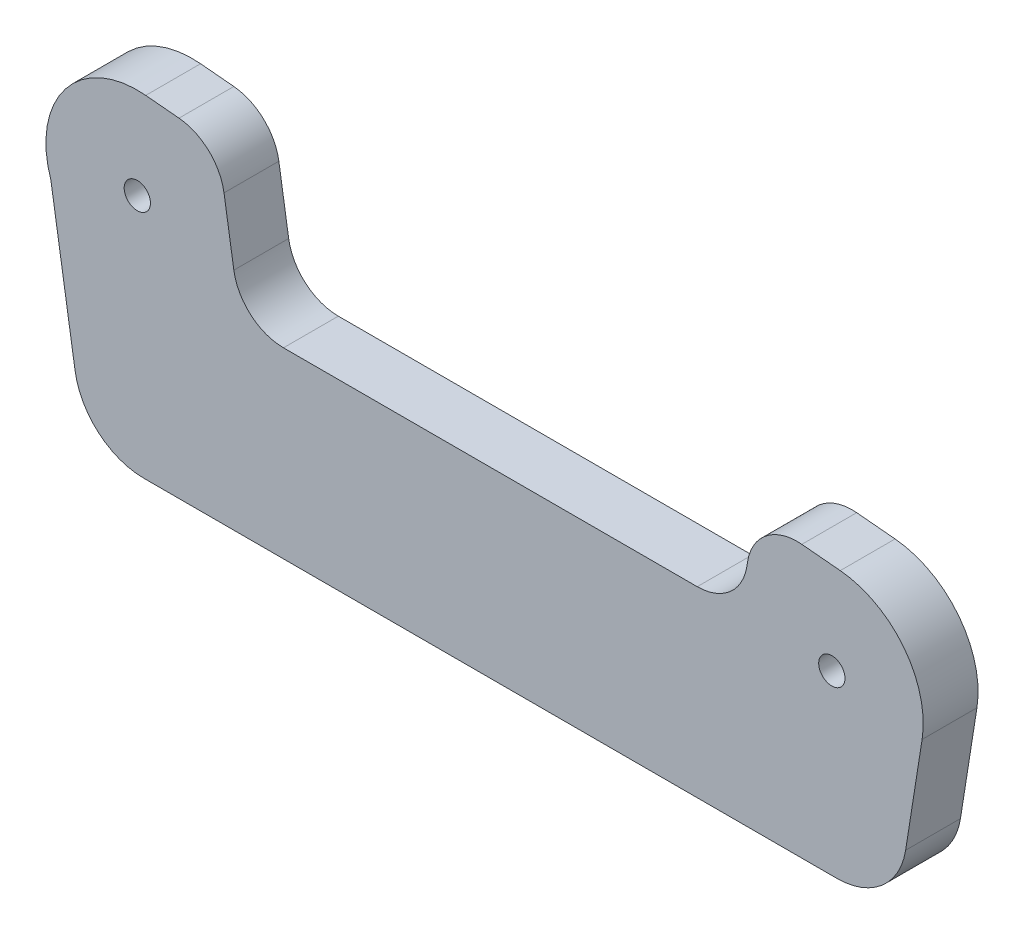
ISO-10303-21;
HEADER;
FILE_DESCRIPTION(('STEP AP214'),'2;1');
FILE_NAME('part.step','',(''),(''),'','','');
FILE_SCHEMA(('AUTOMOTIVE_DESIGN { 1 0 10303 214 1 1 1 1 }'));
ENDSEC;
DATA;
#1=APPLICATION_CONTEXT('core data for automotive mechanical design processes');
#2=APPLICATION_PROTOCOL_DEFINITION('international standard','automotive_design',2000,#1);
#3=PRODUCT_CONTEXT('',#1,'mechanical');
#4=PRODUCT('Part','Part','',(#3));
#5=PRODUCT_RELATED_PRODUCT_CATEGORY('part','',(#4));
#6=PRODUCT_DEFINITION_FORMATION('','',#4);
#7=PRODUCT_DEFINITION_CONTEXT('part definition',#1,'design');
#8=PRODUCT_DEFINITION('design','',#6,#7);
#9=PRODUCT_DEFINITION_SHAPE('','',#8);
#10=(LENGTH_UNIT() NAMED_UNIT(*) SI_UNIT(.MILLI.,.METRE.));
#11=(NAMED_UNIT(*) PLANE_ANGLE_UNIT() SI_UNIT($,.RADIAN.));
#12=(NAMED_UNIT(*) SI_UNIT($,.STERADIAN.) SOLID_ANGLE_UNIT());
#13=UNCERTAINTY_MEASURE_WITH_UNIT(LENGTH_MEASURE(1.E-05),#10,'distance_accuracy_value','');
#14=(GEOMETRIC_REPRESENTATION_CONTEXT(3) GLOBAL_UNCERTAINTY_ASSIGNED_CONTEXT((#13)) GLOBAL_UNIT_ASSIGNED_CONTEXT((#10,
#11,#12)) REPRESENTATION_CONTEXT('',''));
#15=CARTESIAN_POINT('',(0.,0.,0.));
#16=DIRECTION('',(0.,0.,1.));
#17=DIRECTION('',(1.,0.,0.));
#18=AXIS2_PLACEMENT_3D('',#15,#16,#17);
#19=CARTESIAN_POINT('',(3.32127577793633,35.8760563279361,5.999988));
#20=DIRECTION('',(0.092182213968788,0.995742155092277,0.));
#21=DIRECTION('',(-0.995742155092277,0.092182213968788,0.));
#22=AXIS2_PLACEMENT_3D('',#19,#20,#21);
#23=PLANE('',#22);
#24=DIRECTION('',(0.995742155092277,-0.092182213968788,0.));
#25=VECTOR('',#24,1.);
#26=CARTESIAN_POINT('',(3.32127577793633,35.8760563279361,0.));
#27=LINE('',#26,#25);
#28=CARTESIAN_POINT('',(69.6383226526439,29.7366635408386,0.));
#29=VERTEX_POINT('',#28);
#30=CARTESIAN_POINT('',(73.8388350556879,29.3477952669228,0.));
#31=VERTEX_POINT('',#30);
#32=EDGE_CURVE('E203',#29,#31,#27,.T.);
#33=ORIENTED_EDGE('',*,*,#32,.F.);
#34=DIRECTION('',(0.,0.,1.));
#35=VECTOR('',#34,1.);
#36=CARTESIAN_POINT('',(69.6383226526438,29.7366635408386,5.999988));
#37=LINE('',#36,#35);
#38=CARTESIAN_POINT('',(69.6383226526439,29.7366635408386,5.999988));
#39=VERTEX_POINT('',#38);
#40=EDGE_CURVE('E254',#29,#39,#37,.T.);
#41=ORIENTED_EDGE('',*,*,#40,.T.);
#42=DIRECTION('',(0.995742155092277,-0.092182213968788,0.));
#43=VECTOR('',#42,1.);
#44=CARTESIAN_POINT('',(3.32127577793633,35.8760563279361,5.999988));
#45=LINE('',#44,#43);
#46=CARTESIAN_POINT('',(73.8388350556879,29.3477952669228,5.999988));
#47=VERTEX_POINT('',#46);
#48=EDGE_CURVE('E177',#39,#47,#45,.T.);
#49=ORIENTED_EDGE('',*,*,#48,.T.);
#50=DIRECTION('',(0.,0.,-1.));
#51=VECTOR('',#50,1.);
#52=CARTESIAN_POINT('',(73.8388350556879,29.3477952669228,5.999988));
#53=LINE('',#52,#51);
#54=EDGE_CURVE('E200',#47,#31,#53,.T.);
#55=ORIENTED_EDGE('',*,*,#54,.T.);
#56=EDGE_LOOP('',(#33,#41,#49,#55));
#57=FACE_BOUND('',#56,.T.);
#58=ADVANCED_FACE('F37',(#57),#23,.T.);
#59=CARTESIAN_POINT('',(-2.14519077631211,36.3821220669228,5.999988));
#60=VERTEX_POINT('',#59);
#61=CARTESIAN_POINT('',(1.49337603775086,36.0452766869433,5.999988));
#62=VERTEX_POINT('',#61);
#63=EDGE_CURVE('E155',#60,#62,#45,.T.);
#64=ORIENTED_EDGE('',*,*,#63,.T.);
#65=DIRECTION('',(0.,0.,1.));
#66=VECTOR('',#65,1.);
#67=CARTESIAN_POINT('',(1.49337603775086,36.0452766869433,0.));
#68=LINE('',#67,#66);
#69=CARTESIAN_POINT('',(1.49337603775086,36.0452766869433,0.));
#70=VERTEX_POINT('',#69);
#71=EDGE_CURVE('E267',#62,#70,#68,.F.);
#72=ORIENTED_EDGE('',*,*,#71,.T.);
#73=CARTESIAN_POINT('',(-2.14519077631211,36.3821220669228,0.));
#74=VERTEX_POINT('',#73);
#75=EDGE_CURVE('E157',#74,#70,#27,.T.);
#76=ORIENTED_EDGE('',*,*,#75,.F.);
#77=DIRECTION('',(0.,0.,-1.));
#78=VECTOR('',#77,1.);
#79=CARTESIAN_POINT('',(-2.14519077631211,36.3821220669228,5.999988));
#80=LINE('',#79,#78);
#81=EDGE_CURVE('E151',#60,#74,#80,.T.);
#82=ORIENTED_EDGE('',*,*,#81,.F.);
#83=EDGE_LOOP('',(#64,#72,#76,#82));
#84=FACE_BOUND('',#83,.T.);
#85=ADVANCED_FACE('F153',(#84),#23,.T.);
#86=CARTESIAN_POINT('',(-3.067012916,26.424700516,5.999988));
#87=DIRECTION('',(0.,0.,-1.));
#88=DIRECTION('',(-1.,0.,0.));
#89=AXIS2_PLACEMENT_3D('',#86,#87,#88);
#90=CYLINDRICAL_SURFACE('',#89,10.);
#91=CARTESIAN_POINT('',(-3.067012916,26.424700516,0.));
#92=DIRECTION('',(0.,0.,1.));
#93=DIRECTION('',(1.,0.,0.));
#94=AXIS2_PLACEMENT_3D('',#91,#92,#93);
#95=CIRCLE('',#94,10.);
#96=CARTESIAN_POINT('',(-12.5245483205324,23.1758508623508,0.));
#97=VERTEX_POINT('',#96);
#98=EDGE_CURVE('E202',#74,#97,#95,.T.);
#99=ORIENTED_EDGE('',*,*,#98,.T.);
#100=DIRECTION('',(0.,0.,-1.));
#101=VECTOR('',#100,1.);
#102=CARTESIAN_POINT('',(-12.5245483205324,23.1758508623508,5.999988));
#103=LINE('',#102,#101);
#104=CARTESIAN_POINT('',(-12.5245483205324,23.1758508623508,5.999988));
#105=VERTEX_POINT('',#104);
#106=EDGE_CURVE('E161',#105,#97,#103,.T.);
#107=ORIENTED_EDGE('',*,*,#106,.F.);
#108=CARTESIAN_POINT('',(-3.067012916,26.424700516,5.999988));
#109=DIRECTION('',(0.,0.,1.));
#110=DIRECTION('',(1.,0.,0.));
#111=AXIS2_PLACEMENT_3D('',#108,#109,#110);
#112=CIRCLE('',#111,10.);
#113=EDGE_CURVE('E164',#60,#105,#112,.T.);
#114=ORIENTED_EDGE('',*,*,#113,.F.);
#115=ORIENTED_EDGE('',*,*,#81,.T.);
#116=EDGE_LOOP('',(#99,#107,#114,#115));
#117=FACE_BOUND('',#116,.T.);
#118=ADVANCED_FACE('F165',(#117),#90,.T.);
#119=CARTESIAN_POINT('',(-8.64255656417761,-1.36700988840257,5.999988));
#120=DIRECTION('',(0.987720750191728,0.156229701531723,0.));
#121=DIRECTION('',(-0.156229701531723,0.987720750191728,0.));
#122=AXIS2_PLACEMENT_3D('',#119,#120,#121);
#123=PLANE('',#122);
#124=DIRECTION('',(0.156229701531723,-0.987720750191728,0.));
#125=VECTOR('',#124,1.);
#126=CARTESIAN_POINT('',(-8.64255656417761,-1.36700988840257,0.));
#127=LINE('',#126,#125);
#128=CARTESIAN_POINT('',(-9.87575030707435,6.42952967432827,0.));
#129=VERTEX_POINT('',#128);
#130=EDGE_CURVE('E205',#97,#129,#127,.T.);
#131=ORIENTED_EDGE('',*,*,#130,.T.);
#132=DIRECTION('',(0.,0.,-1.));
#133=VECTOR('',#132,1.);
#134=CARTESIAN_POINT('',(-9.87575030707435,6.42952967432827,5.999988));
#135=LINE('',#134,#133);
#136=CARTESIAN_POINT('',(-9.87575030707435,6.42952967432827,5.999988));
#137=VERTEX_POINT('',#136);
#138=EDGE_CURVE('E242',#129,#137,#135,.F.);
#139=ORIENTED_EDGE('',*,*,#138,.T.);
#140=DIRECTION('',(0.156229701531723,-0.987720750191728,0.));
#141=VECTOR('',#140,1.);
#142=CARTESIAN_POINT('',(-8.64255656417761,-1.36700988840257,5.999988));
#143=LINE('',#142,#141);
#144=EDGE_CURVE('E170',#105,#137,#143,.T.);
#145=ORIENTED_EDGE('',*,*,#144,.F.);
#146=ORIENTED_EDGE('',*,*,#106,.T.);
#147=EDGE_LOOP('',(#131,#139,#145,#146));
#148=FACE_BOUND('',#147,.T.);
#149=ADVANCED_FACE('F336',(#148),#123,.F.);
#150=CARTESIAN_POINT('',(0.,0.,5.999988));
#151=DIRECTION('',(0.,1.,0.));
#152=DIRECTION('',(-1.,0.,0.));
#153=AXIS2_PLACEMENT_3D('',#150,#151,#152);
#154=PLANE('',#153);
#155=DIRECTION('',(1.,0.,0.));
#156=VECTOR('',#155,1.);
#157=CARTESIAN_POINT('',(0.,0.,0.));
#158=LINE('',#157,#156);
#159=CARTESIAN_POINT('',(-2.34931819061338,0.,0.));
#160=VERTEX_POINT('',#159);
#161=CARTESIAN_POINT('',(73.4648580709463,0.,0.));
#162=VERTEX_POINT('',#161);
#163=EDGE_CURVE('E208',#160,#162,#158,.T.);
#164=ORIENTED_EDGE('',*,*,#163,.T.);
#165=DIRECTION('',(0.,0.,-1.));
#166=VECTOR('',#165,1.);
#167=CARTESIAN_POINT('',(73.4648580709463,0.,5.999988));
#168=LINE('',#167,#166);
#169=CARTESIAN_POINT('',(73.4648580709463,0.,5.999988));
#170=VERTEX_POINT('',#169);
#171=EDGE_CURVE('E236',#162,#170,#168,.F.);
#172=ORIENTED_EDGE('',*,*,#171,.T.);
#173=DIRECTION('',(1.,0.,0.));
#174=VECTOR('',#173,1.);
#175=CARTESIAN_POINT('',(0.,0.,5.999988));
#176=LINE('',#175,#174);
#177=CARTESIAN_POINT('',(-2.34931819061338,0.,5.999988));
#178=VERTEX_POINT('',#177);
#179=EDGE_CURVE('E185',#178,#170,#176,.T.);
#180=ORIENTED_EDGE('',*,*,#179,.F.);
#181=DIRECTION('',(0.,0.,-1.));
#182=VECTOR('',#181,1.);
#183=CARTESIAN_POINT('',(-2.34931819061338,0.,5.999988));
#184=LINE('',#183,#182);
#185=EDGE_CURVE('E233',#178,#160,#184,.T.);
#186=ORIENTED_EDGE('',*,*,#185,.T.);
#187=EDGE_LOOP('',(#164,#172,#180,#186));
#188=FACE_BOUND('',#187,.T.);
#189=ADVANCED_FACE('F327',(#188),#154,.F.);
#190=CARTESIAN_POINT('',(78.022328285015,-12.3409425775573,5.999988));
#191=DIRECTION('',(0.987720750191728,-0.156229701531722,0.));
#192=DIRECTION('',(0.156229701531722,0.987720750191728,0.));
#193=AXIS2_PLACEMENT_3D('',#190,#191,#192);
#194=PLANE('',#193);
#195=DIRECTION('',(-0.156229701531722,-0.987720750191728,0.));
#196=VECTOR('',#195,1.);
#197=CARTESIAN_POINT('',(78.022328285015,-12.3409425775573,5.999988));
#198=LINE('',#197,#196);
#199=CARTESIAN_POINT('',(82.7942204179173,17.8280767006828,5.999988));
#200=VERTEX_POINT('',#199);
#201=CARTESIAN_POINT('',(80.9912901874073,6.42952967432827,5.999988));
#202=VERTEX_POINT('',#201);
#203=EDGE_CURVE('E188',#200,#202,#198,.T.);
#204=ORIENTED_EDGE('',*,*,#203,.T.);
#205=DIRECTION('',(0.,0.,-1.));
#206=VECTOR('',#205,1.);
#207=CARTESIAN_POINT('',(80.9912901874073,6.42952967432827,0.));
#208=LINE('',#207,#206);
#209=CARTESIAN_POINT('',(80.9912901874073,6.42952967432827,0.));
#210=VERTEX_POINT('',#209);
#211=EDGE_CURVE('E160',#202,#210,#208,.T.);
#212=ORIENTED_EDGE('',*,*,#211,.T.);
#213=DIRECTION('',(-0.156229701531722,-0.987720750191728,0.));
#214=VECTOR('',#213,1.);
#215=CARTESIAN_POINT('',(78.022328285015,-12.3409425775573,0.));
#216=LINE('',#215,#214);
#217=CARTESIAN_POINT('',(82.7942204179173,17.8280767006828,0.));
#218=VERTEX_POINT('',#217);
#219=EDGE_CURVE('E211',#218,#210,#216,.T.);
#220=ORIENTED_EDGE('',*,*,#219,.F.);
#221=DIRECTION('',(0.,0.,-1.));
#222=VECTOR('',#221,1.);
#223=CARTESIAN_POINT('',(82.7942204179173,17.8280767006828,5.999988));
#224=LINE('',#223,#222);
#225=EDGE_CURVE('E224',#200,#218,#224,.T.);
#226=ORIENTED_EDGE('',*,*,#225,.F.);
#227=EDGE_LOOP('',(#204,#212,#220,#226));
#228=FACE_BOUND('',#227,.T.);
#229=ADVANCED_FACE('F318',(#228),#194,.T.);
#230=CARTESIAN_POINT('',(72.917012916,19.390373716,5.999988));
#231=DIRECTION('',(0.,0.,-1.));
#232=DIRECTION('',(-1.,0.,0.));
#233=AXIS2_PLACEMENT_3D('',#230,#231,#232);
#234=CYLINDRICAL_SURFACE('',#233,1.43749999999999);
#235=CARTESIAN_POINT('',(72.917012916,19.390373716,5.999988));
#236=DIRECTION('',(0.,0.,1.));
#237=DIRECTION('',(1.,0.,0.));
#238=AXIS2_PLACEMENT_3D('',#235,#236,#237);
#239=CIRCLE('',#238,1.43749999999999);
#240=CARTESIAN_POINT('',(74.354512916,19.390373716,5.999988));
#241=VERTEX_POINT('',#240);
#242=EDGE_CURVE('E194',#241,#241,#239,.T.);
#243=ORIENTED_EDGE('',*,*,#242,.T.);
#244=EDGE_LOOP('',(#243));
#245=FACE_BOUND('',#244,.T.);
#246=CARTESIAN_POINT('',(72.917012916,19.390373716,0.));
#247=DIRECTION('',(0.,0.,1.));
#248=DIRECTION('',(1.,0.,0.));
#249=AXIS2_PLACEMENT_3D('',#246,#247,#248);
#250=CIRCLE('',#249,1.43749999999999);
#251=CARTESIAN_POINT('',(74.354512916,19.390373716,0.));
#252=VERTEX_POINT('',#251);
#253=EDGE_CURVE('E217',#252,#252,#250,.T.);
#254=ORIENTED_EDGE('',*,*,#253,.F.);
#255=EDGE_LOOP('',(#254));
#256=FACE_BOUND('',#255,.T.);
#257=ADVANCED_FACE('F459',(#245,#256),#234,.F.);
#258=CARTESIAN_POINT('',(72.917012916,19.390373716,5.999988));
#259=DIRECTION('',(0.,0.,-1.));
#260=DIRECTION('',(-1.,0.,0.));
#261=AXIS2_PLACEMENT_3D('',#258,#259,#260);
#262=CYLINDRICAL_SURFACE('',#261,10.);
#263=CARTESIAN_POINT('',(72.917012916,19.390373716,0.));
#264=DIRECTION('',(0.,0.,1.));
#265=DIRECTION('',(1.,0.,0.));
#266=AXIS2_PLACEMENT_3D('',#263,#264,#265);
#267=CIRCLE('',#266,10.);
#268=EDGE_CURVE('E214',#218,#31,#267,.T.);
#269=ORIENTED_EDGE('',*,*,#268,.T.);
#270=ORIENTED_EDGE('',*,*,#54,.F.);
#271=CARTESIAN_POINT('',(72.917012916,19.390373716,5.999988));
#272=DIRECTION('',(0.,0.,1.));
#273=DIRECTION('',(1.,0.,0.));
#274=AXIS2_PLACEMENT_3D('',#271,#272,#273);
#275=CIRCLE('',#274,10.);
#276=EDGE_CURVE('E191',#200,#47,#275,.T.);
#277=ORIENTED_EDGE('',*,*,#276,.F.);
#278=ORIENTED_EDGE('',*,*,#225,.T.);
#279=EDGE_LOOP('',(#269,#270,#277,#278));
#280=FACE_BOUND('',#279,.T.);
#281=ADVANCED_FACE('F315',(#280),#262,.T.);
#282=CARTESIAN_POINT('',(-3.067012916,26.424700516,5.999988));
#283=DIRECTION('',(0.,0.,-1.));
#284=DIRECTION('',(-1.,0.,0.));
#285=AXIS2_PLACEMENT_3D('',#282,#283,#284);
#286=CYLINDRICAL_SURFACE('',#285,1.4375);
#287=CARTESIAN_POINT('',(-3.067012916,26.424700516,5.999988));
#288=DIRECTION('',(0.,0.,1.));
#289=DIRECTION('',(1.,0.,0.));
#290=AXIS2_PLACEMENT_3D('',#287,#288,#289);
#291=CIRCLE('',#290,1.4375);
#292=CARTESIAN_POINT('',(-1.629512916,26.424700516,5.999988));
#293=VERTEX_POINT('',#292);
#294=EDGE_CURVE('E197',#293,#293,#291,.T.);
#295=ORIENTED_EDGE('',*,*,#294,.T.);
#296=EDGE_LOOP('',(#295));
#297=FACE_BOUND('',#296,.T.);
#298=CARTESIAN_POINT('',(-3.067012916,26.424700516,0.));
#299=DIRECTION('',(0.,0.,1.));
#300=DIRECTION('',(1.,0.,0.));
#301=AXIS2_PLACEMENT_3D('',#298,#299,#300);
#302=CIRCLE('',#301,1.4375);
#303=CARTESIAN_POINT('',(-1.629512916,26.424700516,0.));
#304=VERTEX_POINT('',#303);
#305=EDGE_CURVE('E179',#304,#304,#302,.T.);
#306=ORIENTED_EDGE('',*,*,#305,.F.);
#307=EDGE_LOOP('',(#306));
#308=FACE_BOUND('',#307,.T.);
#309=ADVANCED_FACE('F427',(#297,#308),#286,.F.);
#310=CARTESIAN_POINT('',(0.,0.,5.999988));
#311=DIRECTION('',(0.,0.,1.));
#312=DIRECTION('',(1.,0.,0.));
#313=AXIS2_PLACEMENT_3D('',#310,#311,#312);
#314=PLANE('',#313);
#315=ORIENTED_EDGE('',*,*,#48,.F.);
#316=CARTESIAN_POINT('',(69.1313204758155,24.2600816878311,5.999988));
#317=DIRECTION('',(0.,0.,1.));
#318=DIRECTION('',(1.,0.,0.));
#319=AXIS2_PLACEMENT_3D('',#316,#317,#318);
#320=CIRCLE('',#319,5.5);
#321=CARTESIAN_POINT('',(63.698856349761,25.1193450462556,5.999988));
#322=VERTEX_POINT('',#321);
#323=EDGE_CURVE('E258',#39,#322,#320,.T.);
#324=ORIENTED_EDGE('',*,*,#323,.T.);
#325=DIRECTION('',(0.156229701531724,0.987720750191727,0.));
#326=VECTOR('',#325,1.);
#327=CARTESIAN_POINT('',(62.889119641831,20.,5.999988));
#328=LINE('',#327,#326);
#329=CARTESIAN_POINT('',(63.6231539326565,24.6407366415755,5.999988));
#330=VERTEX_POINT('',#329);
#331=EDGE_CURVE('E181',#330,#322,#328,.T.);
#332=ORIENTED_EDGE('',*,*,#331,.F.);
#333=CARTESIAN_POINT('',(58.190689806602,25.5,5.999988));
#334=DIRECTION('',(0.,0.,1.));
#335=DIRECTION('',(1.,0.,0.));
#336=AXIS2_PLACEMENT_3D('',#333,#334,#335);
#337=CIRCLE('',#336,5.5);
#338=CARTESIAN_POINT('',(58.190689806602,20.,5.999988));
#339=VERTEX_POINT('',#338);
#340=EDGE_CURVE('E269',#330,#339,#337,.F.);
#341=ORIENTED_EDGE('',*,*,#340,.T.);
#342=DIRECTION('',(1.,0.,0.));
#343=VECTOR('',#342,1.);
#344=CARTESIAN_POINT('',(8.22642023850194,20.,5.999988));
#345=LINE('',#344,#343);
#346=CARTESIAN_POINT('',(12.9248500737309,20.,5.999988));
#347=VERTEX_POINT('',#346);
#348=EDGE_CURVE('E275',#347,#339,#345,.T.);
#349=ORIENTED_EDGE('',*,*,#348,.F.);
#350=CARTESIAN_POINT('',(12.9248500737309,25.5,5.999988));
#351=DIRECTION('',(0.,0.,1.));
#352=DIRECTION('',(1.,0.,0.));
#353=AXIS2_PLACEMENT_3D('',#350,#351,#352);
#354=CIRCLE('',#353,5.5);
#355=CARTESIAN_POINT('',(7.49238594767638,24.6407366415755,5.999988));
#356=VERTEX_POINT('',#355);
#357=EDGE_CURVE('E45',#347,#356,#354,.F.);
#358=ORIENTED_EDGE('',*,*,#357,.T.);
#359=DIRECTION('',(0.156229701531723,-0.987720750191727,0.));
#360=VECTOR('',#359,1.);
#361=CARTESIAN_POINT('',(5.75084992302503,35.6511351246404,5.999988));
#362=LINE('',#361,#360);
#363=CARTESIAN_POINT('',(6.41883798697703,31.4279581923602,5.999988));
#364=VERTEX_POINT('',#363);
#365=EDGE_CURVE('E273',#364,#356,#362,.T.);
#366=ORIENTED_EDGE('',*,*,#365,.F.);
#367=CARTESIAN_POINT('',(0.986373860922528,30.5686948339357,5.999988));
#368=DIRECTION('',(0.,0.,1.));
#369=DIRECTION('',(1.,0.,0.));
#370=AXIS2_PLACEMENT_3D('',#367,#368,#369);
#371=CIRCLE('',#370,5.5);
#372=EDGE_CURVE('E176',#364,#62,#371,.T.);
#373=ORIENTED_EDGE('',*,*,#372,.T.);
#374=ORIENTED_EDGE('',*,*,#63,.F.);
#375=ORIENTED_EDGE('',*,*,#113,.T.);
#376=ORIENTED_EDGE('',*,*,#144,.T.);
#377=CARTESIAN_POINT('',(-2.34931819061338,7.62,5.999988));
#378=DIRECTION('',(0.,0.,1.));
#379=DIRECTION('',(1.,0.,0.));
#380=AXIS2_PLACEMENT_3D('',#377,#378,#379);
#381=CIRCLE('',#380,7.62);
#382=EDGE_CURVE('E238',#137,#178,#381,.T.);
#383=ORIENTED_EDGE('',*,*,#382,.T.);
#384=ORIENTED_EDGE('',*,*,#179,.T.);
#385=CARTESIAN_POINT('',(73.4648580709463,7.62,5.999988));
#386=DIRECTION('',(0.,0.,1.));
#387=DIRECTION('',(1.,0.,0.));
#388=AXIS2_PLACEMENT_3D('',#385,#386,#387);
#389=CIRCLE('',#388,7.62);
#390=EDGE_CURVE('E240',#170,#202,#389,.T.);
#391=ORIENTED_EDGE('',*,*,#390,.T.);
#392=ORIENTED_EDGE('',*,*,#203,.F.);
#393=ORIENTED_EDGE('',*,*,#276,.T.);
#394=EDGE_LOOP('',(#315,#324,#332,#341,#349,#358,#366,#373,#374,#375,#376,#383,#384,#391,#392,#393));
#395=FACE_BOUND('',#394,.T.);
#396=ORIENTED_EDGE('',*,*,#242,.F.);
#397=EDGE_LOOP('',(#396));
#398=FACE_BOUND('',#397,.T.);
#399=ORIENTED_EDGE('',*,*,#294,.F.);
#400=EDGE_LOOP('',(#399));
#401=FACE_BOUND('',#400,.T.);
#402=ADVANCED_FACE('F173',(#395,#398,#401),#314,.T.);
#403=CARTESIAN_POINT('',(0.,0.,0.));
#404=DIRECTION('',(0.,0.,1.));
#405=DIRECTION('',(1.,0.,0.));
#406=AXIS2_PLACEMENT_3D('',#403,#404,#405);
#407=PLANE('',#406);
#408=DIRECTION('',(0.156229701531724,0.987720750191727,0.));
#409=VECTOR('',#408,1.);
#410=CARTESIAN_POINT('',(62.889119641831,20.,0.));
#411=LINE('',#410,#409);
#412=CARTESIAN_POINT('',(63.6231539326565,24.6407366415755,0.));
#413=VERTEX_POINT('',#412);
#414=CARTESIAN_POINT('',(63.698856349761,25.1193450462556,0.));
#415=VERTEX_POINT('',#414);
#416=EDGE_CURVE('E294',#413,#415,#411,.T.);
#417=ORIENTED_EDGE('',*,*,#416,.T.);
#418=CARTESIAN_POINT('',(69.1313204758155,24.2600816878311,0.));
#419=DIRECTION('',(0.,0.,1.));
#420=DIRECTION('',(1.,0.,0.));
#421=AXIS2_PLACEMENT_3D('',#418,#419,#420);
#422=CIRCLE('',#421,5.5);
#423=EDGE_CURVE('E261',#415,#29,#422,.F.);
#424=ORIENTED_EDGE('',*,*,#423,.T.);
#425=ORIENTED_EDGE('',*,*,#32,.T.);
#426=ORIENTED_EDGE('',*,*,#268,.F.);
#427=ORIENTED_EDGE('',*,*,#219,.T.);
#428=CARTESIAN_POINT('',(73.4648580709463,7.62,0.));
#429=DIRECTION('',(0.,0.,1.));
#430=DIRECTION('',(1.,0.,0.));
#431=AXIS2_PLACEMENT_3D('',#428,#429,#430);
#432=CIRCLE('',#431,7.62);
#433=EDGE_CURVE('E231',#210,#162,#432,.F.);
#434=ORIENTED_EDGE('',*,*,#433,.T.);
#435=ORIENTED_EDGE('',*,*,#163,.F.);
#436=CARTESIAN_POINT('',(-2.34931819061338,7.62,0.));
#437=DIRECTION('',(0.,0.,1.));
#438=DIRECTION('',(1.,0.,0.));
#439=AXIS2_PLACEMENT_3D('',#436,#437,#438);
#440=CIRCLE('',#439,7.62);
#441=EDGE_CURVE('E229',#160,#129,#440,.F.);
#442=ORIENTED_EDGE('',*,*,#441,.T.);
#443=ORIENTED_EDGE('',*,*,#130,.F.);
#444=ORIENTED_EDGE('',*,*,#98,.F.);
#445=ORIENTED_EDGE('',*,*,#75,.T.);
#446=CARTESIAN_POINT('',(0.986373860922528,30.5686948339357,0.));
#447=DIRECTION('',(0.,0.,1.));
#448=DIRECTION('',(1.,0.,0.));
#449=AXIS2_PLACEMENT_3D('',#446,#447,#448);
#450=CIRCLE('',#449,5.5);
#451=CARTESIAN_POINT('',(6.41883798697703,31.4279581923602,0.));
#452=VERTEX_POINT('',#451);
#453=EDGE_CURVE('E59',#70,#452,#450,.F.);
#454=ORIENTED_EDGE('',*,*,#453,.T.);
#455=DIRECTION('',(0.156229701531723,-0.987720750191727,0.));
#456=VECTOR('',#455,1.);
#457=CARTESIAN_POINT('',(5.75084992302503,35.6511351246404,0.));
#458=LINE('',#457,#456);
#459=CARTESIAN_POINT('',(7.49238594767638,24.6407366415755,0.));
#460=VERTEX_POINT('',#459);
#461=EDGE_CURVE('E290',#452,#460,#458,.T.);
#462=ORIENTED_EDGE('',*,*,#461,.T.);
#463=CARTESIAN_POINT('',(12.9248500737309,25.5,0.));
#464=DIRECTION('',(0.,0.,1.));
#465=DIRECTION('',(1.,0.,0.));
#466=AXIS2_PLACEMENT_3D('',#463,#464,#465);
#467=CIRCLE('',#466,5.5);
#468=CARTESIAN_POINT('',(12.9248500737309,20.,0.));
#469=VERTEX_POINT('',#468);
#470=EDGE_CURVE('E11',#460,#469,#467,.T.);
#471=ORIENTED_EDGE('',*,*,#470,.T.);
#472=DIRECTION('',(1.,0.,0.));
#473=VECTOR('',#472,1.);
#474=CARTESIAN_POINT('',(8.22642023850194,20.,0.));
#475=LINE('',#474,#473);
#476=CARTESIAN_POINT('',(58.190689806602,20.,0.));
#477=VERTEX_POINT('',#476);
#478=EDGE_CURVE('E288',#469,#477,#475,.T.);
#479=ORIENTED_EDGE('',*,*,#478,.T.);
#480=CARTESIAN_POINT('',(58.190689806602,25.5,0.));
#481=DIRECTION('',(0.,0.,1.));
#482=DIRECTION('',(1.,0.,0.));
#483=AXIS2_PLACEMENT_3D('',#480,#481,#482);
#484=CIRCLE('',#483,5.5);
#485=EDGE_CURVE('E271',#477,#413,#484,.T.);
#486=ORIENTED_EDGE('',*,*,#485,.T.);
#487=EDGE_LOOP('',(#417,#424,#425,#426,#427,#434,#435,#442,#443,#444,#445,#454,#462,#471,#479,#486));
#488=FACE_BOUND('',#487,.T.);
#489=ORIENTED_EDGE('',*,*,#253,.T.);
#490=EDGE_LOOP('',(#489));
#491=FACE_BOUND('',#490,.T.);
#492=ORIENTED_EDGE('',*,*,#305,.T.);
#493=EDGE_LOOP('',(#492));
#494=FACE_BOUND('',#493,.T.);
#495=ADVANCED_FACE('F286',(#488,#491,#494),#407,.F.);
#496=CARTESIAN_POINT('',(73.4648580709463,7.62,5.999988));
#497=DIRECTION('',(0.,0.,1.));
#498=DIRECTION('',(1.,0.,0.));
#499=AXIS2_PLACEMENT_3D('',#496,#497,#498);
#500=CYLINDRICAL_SURFACE('',#499,7.62);
#501=ORIENTED_EDGE('',*,*,#390,.F.);
#502=ORIENTED_EDGE('',*,*,#171,.F.);
#503=ORIENTED_EDGE('',*,*,#433,.F.);
#504=ORIENTED_EDGE('',*,*,#211,.F.);
#505=EDGE_LOOP('',(#501,#502,#503,#504));
#506=FACE_BOUND('',#505,.T.);
#507=ADVANCED_FACE('F323',(#506),#500,.T.);
#508=CARTESIAN_POINT('',(-2.34931819061338,7.62,5.999988));
#509=DIRECTION('',(0.,0.,-1.));
#510=DIRECTION('',(-1.,0.,0.));
#511=AXIS2_PLACEMENT_3D('',#508,#509,#510);
#512=CYLINDRICAL_SURFACE('',#511,7.62);
#513=ORIENTED_EDGE('',*,*,#382,.F.);
#514=ORIENTED_EDGE('',*,*,#138,.F.);
#515=ORIENTED_EDGE('',*,*,#441,.F.);
#516=ORIENTED_EDGE('',*,*,#185,.F.);
#517=EDGE_LOOP('',(#513,#514,#515,#516));
#518=FACE_BOUND('',#517,.T.);
#519=ADVANCED_FACE('F332',(#518),#512,.T.);
#520=CARTESIAN_POINT('',(62.889119641831,20.,0.));
#521=DIRECTION('',(0.987720750191727,-0.156229701531724,0.));
#522=DIRECTION('',(0.156229701531724,0.987720750191727,0.));
#523=AXIS2_PLACEMENT_3D('',#520,#521,#522);
#524=PLANE('',#523);
#525=ORIENTED_EDGE('',*,*,#416,.F.);
#526=DIRECTION('',(0.,0.,1.));
#527=VECTOR('',#526,1.);
#528=CARTESIAN_POINT('',(63.6231539326565,24.6407366415755,5.999988));
#529=LINE('',#528,#527);
#530=EDGE_CURVE('E246',#413,#330,#529,.T.);
#531=ORIENTED_EDGE('',*,*,#530,.T.);
#532=ORIENTED_EDGE('',*,*,#331,.T.);
#533=DIRECTION('',(0.,0.,1.));
#534=VECTOR('',#533,1.);
#535=CARTESIAN_POINT('',(63.698856349761,25.1193450462556,0.));
#536=LINE('',#535,#534);
#537=EDGE_CURVE('E244',#322,#415,#536,.F.);
#538=ORIENTED_EDGE('',*,*,#537,.T.);
#539=EDGE_LOOP('',(#525,#531,#532,#538));
#540=FACE_BOUND('',#539,.T.);
#541=ADVANCED_FACE('F303',(#540),#524,.F.);
#542=CARTESIAN_POINT('',(8.22642023850194,20.,0.));
#543=DIRECTION('',(0.,-1.,0.));
#544=DIRECTION('',(0.,0.,-1.));
#545=AXIS2_PLACEMENT_3D('',#542,#543,#544);
#546=PLANE('',#545);
#547=ORIENTED_EDGE('',*,*,#348,.T.);
#548=DIRECTION('',(0.,0.,1.));
#549=VECTOR('',#548,1.);
#550=CARTESIAN_POINT('',(58.190689806602,20.,0.));
#551=LINE('',#550,#549);
#552=EDGE_CURVE('E252',#339,#477,#551,.F.);
#553=ORIENTED_EDGE('',*,*,#552,.T.);
#554=ORIENTED_EDGE('',*,*,#478,.F.);
#555=DIRECTION('',(0.,0.,1.));
#556=VECTOR('',#555,1.);
#557=CARTESIAN_POINT('',(12.9248500737309,20.,5.999988));
#558=LINE('',#557,#556);
#559=EDGE_CURVE('E249',#469,#347,#558,.T.);
#560=ORIENTED_EDGE('',*,*,#559,.T.);
#561=EDGE_LOOP('',(#547,#553,#554,#560));
#562=FACE_BOUND('',#561,.T.);
#563=ADVANCED_FACE('F292',(#562),#546,.F.);
#564=CARTESIAN_POINT('',(5.75084992302503,35.6511351246404,0.));
#565=DIRECTION('',(-0.987720750191727,-0.156229701531723,0.));
#566=DIRECTION('',(0.156229701531723,-0.987720750191727,0.));
#567=AXIS2_PLACEMENT_3D('',#564,#565,#566);
#568=PLANE('',#567);
#569=ORIENTED_EDGE('',*,*,#365,.T.);
#570=DIRECTION('',(0.,0.,1.));
#571=VECTOR('',#570,1.);
#572=CARTESIAN_POINT('',(7.49238594767638,24.6407366415755,0.));
#573=LINE('',#572,#571);
#574=EDGE_CURVE('E52',#356,#460,#573,.F.);
#575=ORIENTED_EDGE('',*,*,#574,.T.);
#576=ORIENTED_EDGE('',*,*,#461,.F.);
#577=DIRECTION('',(0.,0.,1.));
#578=VECTOR('',#577,1.);
#579=CARTESIAN_POINT('',(6.41883798697703,31.4279581923602,5.999988));
#580=LINE('',#579,#578);
#581=EDGE_CURVE('E263',#452,#364,#580,.T.);
#582=ORIENTED_EDGE('',*,*,#581,.T.);
#583=EDGE_LOOP('',(#569,#575,#576,#582));
#584=FACE_BOUND('',#583,.T.);
#585=ADVANCED_FACE('F278',(#584),#568,.F.);
#586=CARTESIAN_POINT('',(58.190689806602,25.5,0.));
#587=DIRECTION('',(0.,0.,-1.));
#588=DIRECTION('',(-1.,0.,0.));
#589=AXIS2_PLACEMENT_3D('',#586,#587,#588);
#590=CYLINDRICAL_SURFACE('',#589,5.5);
#591=ORIENTED_EDGE('',*,*,#485,.F.);
#592=ORIENTED_EDGE('',*,*,#552,.F.);
#593=ORIENTED_EDGE('',*,*,#340,.F.);
#594=ORIENTED_EDGE('',*,*,#530,.F.);
#595=EDGE_LOOP('',(#591,#592,#593,#594));
#596=FACE_BOUND('',#595,.T.);
#597=ADVANCED_FACE('F355',(#596),#590,.F.);
#598=CARTESIAN_POINT('',(69.1313204758155,24.2600816878311,5.999988));
#599=DIRECTION('',(0.,0.,-1.));
#600=DIRECTION('',(-1.,0.,0.));
#601=AXIS2_PLACEMENT_3D('',#598,#599,#600);
#602=CYLINDRICAL_SURFACE('',#601,5.5);
#603=ORIENTED_EDGE('',*,*,#423,.F.);
#604=ORIENTED_EDGE('',*,*,#537,.F.);
#605=ORIENTED_EDGE('',*,*,#323,.F.);
#606=ORIENTED_EDGE('',*,*,#40,.F.);
#607=EDGE_LOOP('',(#603,#604,#605,#606));
#608=FACE_BOUND('',#607,.T.);
#609=ADVANCED_FACE('F307',(#608),#602,.T.);
#610=CARTESIAN_POINT('',(12.9248500737309,25.5,0.));
#611=DIRECTION('',(0.,0.,-1.));
#612=DIRECTION('',(-1.,0.,0.));
#613=AXIS2_PLACEMENT_3D('',#610,#611,#612);
#614=CYLINDRICAL_SURFACE('',#613,5.5);
#615=ORIENTED_EDGE('',*,*,#470,.F.);
#616=ORIENTED_EDGE('',*,*,#574,.F.);
#617=ORIENTED_EDGE('',*,*,#357,.F.);
#618=ORIENTED_EDGE('',*,*,#559,.F.);
#619=EDGE_LOOP('',(#615,#616,#617,#618));
#620=FACE_BOUND('',#619,.T.);
#621=ADVANCED_FACE('F282',(#620),#614,.F.);
#622=CARTESIAN_POINT('',(0.986373860922528,30.5686948339357,0.));
#623=DIRECTION('',(0.,0.,-1.));
#624=DIRECTION('',(-1.,0.,0.));
#625=AXIS2_PLACEMENT_3D('',#622,#623,#624);
#626=CYLINDRICAL_SURFACE('',#625,5.5);
#627=ORIENTED_EDGE('',*,*,#453,.F.);
#628=ORIENTED_EDGE('',*,*,#71,.F.);
#629=ORIENTED_EDGE('',*,*,#372,.F.);
#630=ORIENTED_EDGE('',*,*,#581,.F.);
#631=EDGE_LOOP('',(#627,#628,#629,#630));
#632=FACE_BOUND('',#631,.T.);
#633=ADVANCED_FACE('F39',(#632),#626,.T.);
#634=CLOSED_SHELL('',(#58,#85,#118,#149,#189,#229,#257,#281,#309,#402,#495,#507,#519,#541,#563,
#585,#597,#609,#621,#633));
#635=MANIFOLD_SOLID_BREP('B2',#634);
#636=ADVANCED_BREP_SHAPE_REPRESENTATION('',(#18,#635),#14);
#637=SHAPE_DEFINITION_REPRESENTATION(#9,#636);
ENDSEC;
END-ISO-10303-21;
